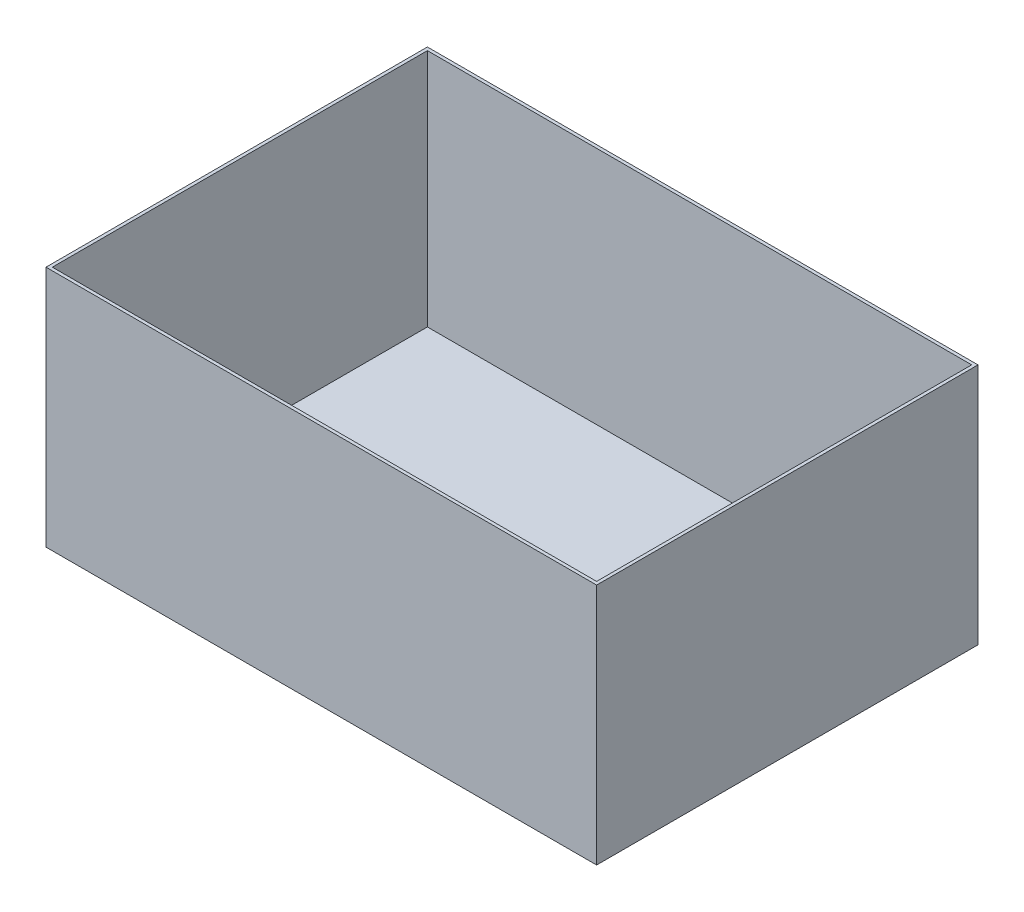
ISO-10303-21;
HEADER;
FILE_DESCRIPTION(('STEP AP214'),'2;1');
FILE_NAME('part.step','',(''),(''),'','','');
FILE_SCHEMA(('AUTOMOTIVE_DESIGN { 1 0 10303 214 1 1 1 1 }'));
ENDSEC;
DATA;
#1=APPLICATION_CONTEXT('core data for automotive mechanical design processes');
#2=APPLICATION_PROTOCOL_DEFINITION('international standard','automotive_design',2000,#1);
#3=PRODUCT_CONTEXT('',#1,'mechanical');
#4=PRODUCT('Part','Part','',(#3));
#5=PRODUCT_RELATED_PRODUCT_CATEGORY('part','',(#4));
#6=PRODUCT_DEFINITION_FORMATION('','',#4);
#7=PRODUCT_DEFINITION_CONTEXT('part definition',#1,'design');
#8=PRODUCT_DEFINITION('design','',#6,#7);
#9=PRODUCT_DEFINITION_SHAPE('','',#8);
#10=(LENGTH_UNIT() NAMED_UNIT(*) SI_UNIT(.MILLI.,.METRE.));
#11=(NAMED_UNIT(*) PLANE_ANGLE_UNIT() SI_UNIT($,.RADIAN.));
#12=(NAMED_UNIT(*) SI_UNIT($,.STERADIAN.) SOLID_ANGLE_UNIT());
#13=UNCERTAINTY_MEASURE_WITH_UNIT(LENGTH_MEASURE(1.E-05),#10,'distance_accuracy_value','');
#14=(GEOMETRIC_REPRESENTATION_CONTEXT(3) GLOBAL_UNCERTAINTY_ASSIGNED_CONTEXT((#13)) GLOBAL_UNIT_ASSIGNED_CONTEXT((#10,
#11,#12)) REPRESENTATION_CONTEXT('',''));
#15=CARTESIAN_POINT('',(0.,0.,0.));
#16=DIRECTION('',(0.,0.,1.));
#17=DIRECTION('',(1.,0.,0.));
#18=AXIS2_PLACEMENT_3D('',#15,#16,#17);
#19=CARTESIAN_POINT('',(276.86,243.84,-191.77));
#20=DIRECTION('',(-1.,0.,0.));
#21=DIRECTION('',(0.,0.,1.));
#22=AXIS2_PLACEMENT_3D('',#19,#20,#21);
#23=PLANE('',#22);
#24=DIRECTION('',(0.,0.,-1.));
#25=VECTOR('',#24,1.);
#26=CARTESIAN_POINT('',(276.86,0.,-191.77));
#27=LINE('',#26,#25);
#28=CARTESIAN_POINT('',(276.86,0.,191.77));
#29=VERTEX_POINT('',#28);
#30=CARTESIAN_POINT('',(276.86,0.,-191.77));
#31=VERTEX_POINT('',#30);
#32=EDGE_CURVE('E149',#29,#31,#27,.T.);
#33=ORIENTED_EDGE('',*,*,#32,.T.);
#34=DIRECTION('',(0.,-1.,0.));
#35=VECTOR('',#34,1.);
#36=CARTESIAN_POINT('',(276.86,243.84,-191.77));
#37=LINE('',#36,#35);
#38=CARTESIAN_POINT('',(276.86,243.84,-191.77));
#39=VERTEX_POINT('',#38);
#40=EDGE_CURVE('E11',#39,#31,#37,.T.);
#41=ORIENTED_EDGE('',*,*,#40,.F.);
#42=DIRECTION('',(0.,0.,-1.));
#43=VECTOR('',#42,1.);
#44=CARTESIAN_POINT('',(276.86,243.84,-191.77));
#45=LINE('',#44,#43);
#46=CARTESIAN_POINT('',(276.86,243.84,191.77));
#47=VERTEX_POINT('',#46);
#48=EDGE_CURVE('E142',#47,#39,#45,.T.);
#49=ORIENTED_EDGE('',*,*,#48,.F.);
#50=DIRECTION('',(0.,-1.,0.));
#51=VECTOR('',#50,1.);
#52=CARTESIAN_POINT('',(276.86,243.84,191.77));
#53=LINE('',#52,#51);
#54=EDGE_CURVE('E148',#47,#29,#53,.T.);
#55=ORIENTED_EDGE('',*,*,#54,.T.);
#56=EDGE_LOOP('',(#33,#41,#49,#55));
#57=FACE_BOUND('',#56,.T.);
#58=ADVANCED_FACE('F35',(#57),#23,.F.);
#59=CARTESIAN_POINT('',(-276.86,243.84,-191.77));
#60=DIRECTION('',(0.,0.,1.));
#61=DIRECTION('',(1.,0.,0.));
#62=AXIS2_PLACEMENT_3D('',#59,#60,#61);
#63=PLANE('',#62);
#64=DIRECTION('',(-1.,0.,0.));
#65=VECTOR('',#64,1.);
#66=CARTESIAN_POINT('',(-276.86,0.,-191.77));
#67=LINE('',#66,#65);
#68=CARTESIAN_POINT('',(-276.86,0.,-191.77));
#69=VERTEX_POINT('',#68);
#70=EDGE_CURVE('E152',#31,#69,#67,.T.);
#71=ORIENTED_EDGE('',*,*,#70,.T.);
#72=DIRECTION('',(0.,-1.,0.));
#73=VECTOR('',#72,1.);
#74=CARTESIAN_POINT('',(-276.86,243.84,-191.77));
#75=LINE('',#74,#73);
#76=CARTESIAN_POINT('',(-276.86,243.84,-191.77));
#77=VERTEX_POINT('',#76);
#78=EDGE_CURVE('E42',#77,#69,#75,.T.);
#79=ORIENTED_EDGE('',*,*,#78,.F.);
#80=DIRECTION('',(-1.,0.,0.));
#81=VECTOR('',#80,1.);
#82=CARTESIAN_POINT('',(-276.86,243.84,-191.77));
#83=LINE('',#82,#81);
#84=EDGE_CURVE('E86',#39,#77,#83,.T.);
#85=ORIENTED_EDGE('',*,*,#84,.F.);
#86=ORIENTED_EDGE('',*,*,#40,.T.);
#87=EDGE_LOOP('',(#71,#79,#85,#86));
#88=FACE_BOUND('',#87,.T.);
#89=ADVANCED_FACE('F181',(#88),#63,.F.);
#90=CARTESIAN_POINT('',(-276.86,243.84,-191.77));
#91=DIRECTION('',(1.,0.,0.));
#92=DIRECTION('',(0.,0.,-1.));
#93=AXIS2_PLACEMENT_3D('',#90,#91,#92);
#94=PLANE('',#93);
#95=DIRECTION('',(0.,0.,1.));
#96=VECTOR('',#95,1.);
#97=CARTESIAN_POINT('',(-276.86,0.,-191.77));
#98=LINE('',#97,#96);
#99=CARTESIAN_POINT('',(-276.86,0.,191.77));
#100=VERTEX_POINT('',#99);
#101=EDGE_CURVE('E154',#69,#100,#98,.T.);
#102=ORIENTED_EDGE('',*,*,#101,.T.);
#103=DIRECTION('',(0.,-1.,0.));
#104=VECTOR('',#103,1.);
#105=CARTESIAN_POINT('',(-276.86,243.84,191.77));
#106=LINE('',#105,#104);
#107=CARTESIAN_POINT('',(-276.86,243.84,191.77));
#108=VERTEX_POINT('',#107);
#109=EDGE_CURVE('E158',#108,#100,#106,.T.);
#110=ORIENTED_EDGE('',*,*,#109,.F.);
#111=DIRECTION('',(0.,0.,1.));
#112=VECTOR('',#111,1.);
#113=CARTESIAN_POINT('',(-276.86,243.84,-191.77));
#114=LINE('',#113,#112);
#115=EDGE_CURVE('E145',#77,#108,#114,.T.);
#116=ORIENTED_EDGE('',*,*,#115,.F.);
#117=ORIENTED_EDGE('',*,*,#78,.T.);
#118=EDGE_LOOP('',(#102,#110,#116,#117));
#119=FACE_BOUND('',#118,.T.);
#120=ADVANCED_FACE('F163',(#119),#94,.F.);
#121=CARTESIAN_POINT('',(-276.86,243.84,191.77));
#122=DIRECTION('',(0.,0.,-1.));
#123=DIRECTION('',(-1.,0.,0.));
#124=AXIS2_PLACEMENT_3D('',#121,#122,#123);
#125=PLANE('',#124);
#126=DIRECTION('',(1.,0.,0.));
#127=VECTOR('',#126,1.);
#128=CARTESIAN_POINT('',(-276.86,0.,191.77));
#129=LINE('',#128,#127);
#130=EDGE_CURVE('E79',#100,#29,#129,.T.);
#131=ORIENTED_EDGE('',*,*,#130,.T.);
#132=ORIENTED_EDGE('',*,*,#54,.F.);
#133=DIRECTION('',(1.,0.,0.));
#134=VECTOR('',#133,1.);
#135=CARTESIAN_POINT('',(-276.86,243.84,191.77));
#136=LINE('',#135,#134);
#137=EDGE_CURVE('E58',#108,#47,#136,.T.);
#138=ORIENTED_EDGE('',*,*,#137,.F.);
#139=ORIENTED_EDGE('',*,*,#109,.T.);
#140=EDGE_LOOP('',(#131,#132,#138,#139));
#141=FACE_BOUND('',#140,.T.);
#142=ADVANCED_FACE('F171',(#141),#125,.F.);
#143=CARTESIAN_POINT('',(0.,243.84,0.));
#144=DIRECTION('',(0.,1.,0.));
#145=DIRECTION('',(0.,0.,1.));
#146=AXIS2_PLACEMENT_3D('',#143,#144,#145);
#147=PLANE('',#146);
#148=DIRECTION('',(0.,0.,-1.));
#149=VECTOR('',#148,1.);
#150=CARTESIAN_POINT('',(273.685,243.84,-191.77));
#151=LINE('',#150,#149);
#152=CARTESIAN_POINT('',(273.685,243.84,188.595));
#153=VERTEX_POINT('',#152);
#154=CARTESIAN_POINT('',(273.685,243.84,-188.595));
#155=VERTEX_POINT('',#154);
#156=EDGE_CURVE('E131',#153,#155,#151,.T.);
#157=ORIENTED_EDGE('',*,*,#156,.F.);
#158=DIRECTION('',(1.,0.,0.));
#159=VECTOR('',#158,1.);
#160=CARTESIAN_POINT('',(-276.86,243.84,188.595));
#161=LINE('',#160,#159);
#162=CARTESIAN_POINT('',(-273.685,243.84,188.595));
#163=VERTEX_POINT('',#162);
#164=EDGE_CURVE('E140',#163,#153,#161,.T.);
#165=ORIENTED_EDGE('',*,*,#164,.F.);
#166=DIRECTION('',(0.,0.,1.));
#167=VECTOR('',#166,1.);
#168=CARTESIAN_POINT('',(-273.685,243.84,-191.77));
#169=LINE('',#168,#167);
#170=CARTESIAN_POINT('',(-273.685,243.84,-188.595));
#171=VERTEX_POINT('',#170);
#172=EDGE_CURVE('E138',#171,#163,#169,.T.);
#173=ORIENTED_EDGE('',*,*,#172,.F.);
#174=DIRECTION('',(-1.,0.,0.));
#175=VECTOR('',#174,1.);
#176=CARTESIAN_POINT('',(-276.86,243.84,-188.595));
#177=LINE('',#176,#175);
#178=EDGE_CURVE('E123',#155,#171,#177,.T.);
#179=ORIENTED_EDGE('',*,*,#178,.F.);
#180=EDGE_LOOP('',(#157,#165,#173,#179));
#181=FACE_BOUND('',#180,.T.);
#182=ORIENTED_EDGE('',*,*,#48,.T.);
#183=ORIENTED_EDGE('',*,*,#84,.T.);
#184=ORIENTED_EDGE('',*,*,#115,.T.);
#185=ORIENTED_EDGE('',*,*,#137,.T.);
#186=EDGE_LOOP('',(#182,#183,#184,#185));
#187=FACE_BOUND('',#186,.T.);
#188=ADVANCED_FACE('F173',(#181,#187),#147,.T.);
#189=CARTESIAN_POINT('',(0.,0.,0.));
#190=DIRECTION('',(0.,1.,0.));
#191=DIRECTION('',(0.,0.,1.));
#192=AXIS2_PLACEMENT_3D('',#189,#190,#191);
#193=PLANE('',#192);
#194=ORIENTED_EDGE('',*,*,#32,.F.);
#195=ORIENTED_EDGE('',*,*,#130,.F.);
#196=ORIENTED_EDGE('',*,*,#101,.F.);
#197=ORIENTED_EDGE('',*,*,#70,.F.);
#198=EDGE_LOOP('',(#194,#195,#196,#197));
#199=FACE_BOUND('',#198,.T.);
#200=ADVANCED_FACE('F167',(#199),#193,.F.);
#201=CARTESIAN_POINT('',(273.685,243.84,-191.77));
#202=DIRECTION('',(-1.,0.,0.));
#203=DIRECTION('',(0.,0.,1.));
#204=AXIS2_PLACEMENT_3D('',#201,#202,#203);
#205=PLANE('',#204);
#206=DIRECTION('',(0.,0.,-1.));
#207=VECTOR('',#206,1.);
#208=CARTESIAN_POINT('',(273.685,3.17500000000001,-191.77));
#209=LINE('',#208,#207);
#210=CARTESIAN_POINT('',(273.685,3.175,188.595));
#211=VERTEX_POINT('',#210);
#212=CARTESIAN_POINT('',(273.685,3.175,-188.595));
#213=VERTEX_POINT('',#212);
#214=EDGE_CURVE('E114',#211,#213,#209,.T.);
#215=ORIENTED_EDGE('',*,*,#214,.F.);
#216=DIRECTION('',(0.,-1.,0.));
#217=VECTOR('',#216,1.);
#218=CARTESIAN_POINT('',(273.685,243.84,188.595));
#219=LINE('',#218,#217);
#220=EDGE_CURVE('E134',#153,#211,#219,.T.);
#221=ORIENTED_EDGE('',*,*,#220,.F.);
#222=ORIENTED_EDGE('',*,*,#156,.T.);
#223=DIRECTION('',(0.,-1.,0.));
#224=VECTOR('',#223,1.);
#225=CARTESIAN_POINT('',(273.685,243.84,-188.595));
#226=LINE('',#225,#224);
#227=EDGE_CURVE('E126',#155,#213,#226,.T.);
#228=ORIENTED_EDGE('',*,*,#227,.T.);
#229=EDGE_LOOP('',(#215,#221,#222,#228));
#230=FACE_BOUND('',#229,.T.);
#231=ADVANCED_FACE('F209',(#230),#205,.T.);
#232=CARTESIAN_POINT('',(-276.86,243.84,-188.595));
#233=DIRECTION('',(0.,0.,1.));
#234=DIRECTION('',(1.,0.,0.));
#235=AXIS2_PLACEMENT_3D('',#232,#233,#234);
#236=PLANE('',#235);
#237=DIRECTION('',(-1.,0.,0.));
#238=VECTOR('',#237,1.);
#239=CARTESIAN_POINT('',(-276.86,3.17500000000001,-188.595));
#240=LINE('',#239,#238);
#241=CARTESIAN_POINT('',(-273.685,3.175,-188.595));
#242=VERTEX_POINT('',#241);
#243=EDGE_CURVE('E108',#213,#242,#240,.T.);
#244=ORIENTED_EDGE('',*,*,#243,.F.);
#245=ORIENTED_EDGE('',*,*,#227,.F.);
#246=ORIENTED_EDGE('',*,*,#178,.T.);
#247=DIRECTION('',(0.,-1.,0.));
#248=VECTOR('',#247,1.);
#249=CARTESIAN_POINT('',(-273.685,243.84,-188.595));
#250=LINE('',#249,#248);
#251=EDGE_CURVE('E120',#171,#242,#250,.T.);
#252=ORIENTED_EDGE('',*,*,#251,.T.);
#253=EDGE_LOOP('',(#244,#245,#246,#252));
#254=FACE_BOUND('',#253,.T.);
#255=ADVANCED_FACE('F121',(#254),#236,.T.);
#256=CARTESIAN_POINT('',(-273.685,243.84,-191.77));
#257=DIRECTION('',(1.,0.,0.));
#258=DIRECTION('',(0.,0.,-1.));
#259=AXIS2_PLACEMENT_3D('',#256,#257,#258);
#260=PLANE('',#259);
#261=DIRECTION('',(0.,0.,1.));
#262=VECTOR('',#261,1.);
#263=CARTESIAN_POINT('',(-273.685,3.17500000000001,-191.77));
#264=LINE('',#263,#262);
#265=CARTESIAN_POINT('',(-273.685,3.175,188.595));
#266=VERTEX_POINT('',#265);
#267=EDGE_CURVE('E112',#242,#266,#264,.T.);
#268=ORIENTED_EDGE('',*,*,#267,.F.);
#269=ORIENTED_EDGE('',*,*,#251,.F.);
#270=ORIENTED_EDGE('',*,*,#172,.T.);
#271=DIRECTION('',(0.,-1.,0.));
#272=VECTOR('',#271,1.);
#273=CARTESIAN_POINT('',(-273.685,243.84,188.595));
#274=LINE('',#273,#272);
#275=EDGE_CURVE('E49',#163,#266,#274,.T.);
#276=ORIENTED_EDGE('',*,*,#275,.T.);
#277=EDGE_LOOP('',(#268,#269,#270,#276));
#278=FACE_BOUND('',#277,.T.);
#279=ADVANCED_FACE('F128',(#278),#260,.T.);
#280=CARTESIAN_POINT('',(-276.86,243.84,188.595));
#281=DIRECTION('',(0.,0.,-1.));
#282=DIRECTION('',(-1.,0.,0.));
#283=AXIS2_PLACEMENT_3D('',#280,#281,#282);
#284=PLANE('',#283);
#285=DIRECTION('',(1.,0.,0.));
#286=VECTOR('',#285,1.);
#287=CARTESIAN_POINT('',(-276.86,3.17500000000001,188.595));
#288=LINE('',#287,#286);
#289=EDGE_CURVE('E129',#266,#211,#288,.T.);
#290=ORIENTED_EDGE('',*,*,#289,.F.);
#291=ORIENTED_EDGE('',*,*,#275,.F.);
#292=ORIENTED_EDGE('',*,*,#164,.T.);
#293=ORIENTED_EDGE('',*,*,#220,.T.);
#294=EDGE_LOOP('',(#290,#291,#292,#293));
#295=FACE_BOUND('',#294,.T.);
#296=ADVANCED_FACE('F239',(#295),#284,.T.);
#297=CARTESIAN_POINT('',(0.,3.175,0.));
#298=DIRECTION('',(0.,1.,0.));
#299=DIRECTION('',(0.,0.,1.));
#300=AXIS2_PLACEMENT_3D('',#297,#298,#299);
#301=PLANE('',#300);
#302=ORIENTED_EDGE('',*,*,#214,.T.);
#303=ORIENTED_EDGE('',*,*,#243,.T.);
#304=ORIENTED_EDGE('',*,*,#267,.T.);
#305=ORIENTED_EDGE('',*,*,#289,.T.);
#306=EDGE_LOOP('',(#302,#303,#304,#305));
#307=FACE_BOUND('',#306,.T.);
#308=ADVANCED_FACE('F110',(#307),#301,.T.);
#309=CLOSED_SHELL('',(#58,#89,#120,#142,#188,#200,#231,#255,#279,#296,#308));
#310=MANIFOLD_SOLID_BREP('B2',#309);
#311=ADVANCED_BREP_SHAPE_REPRESENTATION('',(#18,#310),#14);
#312=SHAPE_DEFINITION_REPRESENTATION(#9,#311);
ENDSEC;
END-ISO-10303-21;
